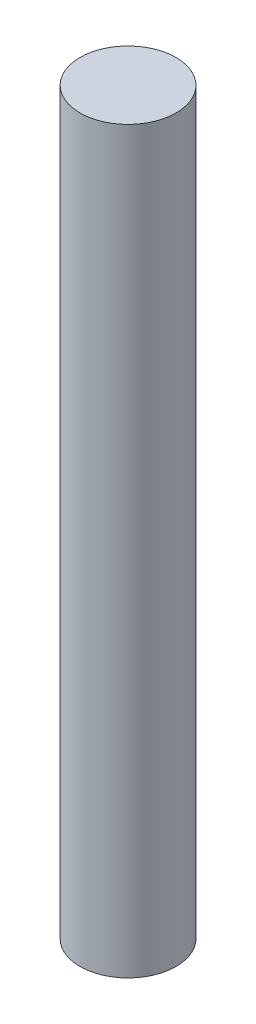
ISO-10303-21;
HEADER;
FILE_DESCRIPTION(('STEP AP214'),'2;1');
FILE_NAME('part.step','',(''),(''),'','','');
FILE_SCHEMA(('AUTOMOTIVE_DESIGN { 1 0 10303 214 1 1 1 1 }'));
ENDSEC;
DATA;
#1=APPLICATION_CONTEXT('core data for automotive mechanical design processes');
#2=APPLICATION_PROTOCOL_DEFINITION('international standard','automotive_design',2000,#1);
#3=PRODUCT_CONTEXT('',#1,'mechanical');
#4=PRODUCT('Part','Part','',(#3));
#5=PRODUCT_RELATED_PRODUCT_CATEGORY('part','',(#4));
#6=PRODUCT_DEFINITION_FORMATION('','',#4);
#7=PRODUCT_DEFINITION_CONTEXT('part definition',#1,'design');
#8=PRODUCT_DEFINITION('design','',#6,#7);
#9=PRODUCT_DEFINITION_SHAPE('','',#8);
#10=(LENGTH_UNIT() NAMED_UNIT(*) SI_UNIT(.MILLI.,.METRE.));
#11=(NAMED_UNIT(*) PLANE_ANGLE_UNIT() SI_UNIT($,.RADIAN.));
#12=(NAMED_UNIT(*) SI_UNIT($,.STERADIAN.) SOLID_ANGLE_UNIT());
#13=UNCERTAINTY_MEASURE_WITH_UNIT(LENGTH_MEASURE(1.E-05),#10,'distance_accuracy_value','');
#14=(GEOMETRIC_REPRESENTATION_CONTEXT(3) GLOBAL_UNCERTAINTY_ASSIGNED_CONTEXT((#13)) GLOBAL_UNIT_ASSIGNED_CONTEXT((#10,
#11,#12)) REPRESENTATION_CONTEXT('',''));
#15=CARTESIAN_POINT('',(0.,0.,0.));
#16=DIRECTION('',(0.,0.,1.));
#17=DIRECTION('',(1.,0.,0.));
#18=AXIS2_PLACEMENT_3D('',#15,#16,#17);
#19=CARTESIAN_POINT('',(0.,38.1,0.));
#20=DIRECTION('',(0.,-1.,0.));
#21=DIRECTION('',(0.,0.,-1.));
#22=AXIS2_PLACEMENT_3D('',#19,#20,#21);
#23=CYLINDRICAL_SURFACE('',#22,2.4765);
#24=CARTESIAN_POINT('',(0.,38.1,0.));
#25=DIRECTION('',(0.,1.,0.));
#26=DIRECTION('',(0.,0.,1.));
#27=AXIS2_PLACEMENT_3D('',#24,#25,#26);
#28=CIRCLE('',#27,2.4765);
#29=CARTESIAN_POINT('',(0.,38.1,-2.4765));
#30=VERTEX_POINT('',#29);
#31=EDGE_CURVE('E10',#30,#30,#28,.T.);
#32=CARTESIAN_POINT('',(0.,0.,0.));
#33=DIRECTION('',(0.,1.,0.));
#34=DIRECTION('',(0.,0.,1.));
#35=AXIS2_PLACEMENT_3D('',#32,#33,#34);
#36=CIRCLE('',#35,2.4765);
#37=CARTESIAN_POINT('',(0.,0.,-2.4765));
#38=VERTEX_POINT('',#37);
#39=EDGE_CURVE('E46',#38,#38,#36,.T.);
#40=CARTESIAN_POINT('',(0.,38.1,-2.4765));
#41=CARTESIAN_POINT('',(0.,37.703125,-2.4765));
#42=CARTESIAN_POINT('',(0.,37.30625,-2.4765));
#43=CARTESIAN_POINT('',(0.,36.5125,-2.4765));
#44=CARTESIAN_POINT('',(0.,36.115625,-2.4765));
#45=CARTESIAN_POINT('',(0.,35.321875,-2.4765));
#46=CARTESIAN_POINT('',(0.,34.925,-2.4765));
#47=CARTESIAN_POINT('',(0.,34.13125,-2.4765));
#48=CARTESIAN_POINT('',(0.,33.734375,-2.4765));
#49=CARTESIAN_POINT('',(0.,32.940625,-2.4765));
#50=CARTESIAN_POINT('',(0.,32.54375,-2.4765));
#51=CARTESIAN_POINT('',(0.,31.75,-2.4765));
#52=CARTESIAN_POINT('',(0.,31.353125,-2.4765));
#53=CARTESIAN_POINT('',(0.,30.559375,-2.4765));
#54=CARTESIAN_POINT('',(0.,30.1625,-2.4765));
#55=CARTESIAN_POINT('',(0.,29.36875,-2.4765));
#56=CARTESIAN_POINT('',(0.,28.971875,-2.4765));
#57=CARTESIAN_POINT('',(0.,28.178125,-2.4765));
#58=CARTESIAN_POINT('',(0.,27.78125,-2.4765));
#59=CARTESIAN_POINT('',(0.,26.9875,-2.4765));
#60=CARTESIAN_POINT('',(0.,26.590625,-2.4765));
#61=CARTESIAN_POINT('',(0.,25.796875,-2.4765));
#62=CARTESIAN_POINT('',(0.,25.4,-2.4765));
#63=CARTESIAN_POINT('',(0.,24.60625,-2.4765));
#64=CARTESIAN_POINT('',(0.,24.209375,-2.4765));
#65=CARTESIAN_POINT('',(0.,23.415625,-2.4765));
#66=CARTESIAN_POINT('',(0.,23.01875,-2.4765));
#67=CARTESIAN_POINT('',(0.,22.225,-2.4765));
#68=CARTESIAN_POINT('',(0.,21.828125,-2.4765));
#69=CARTESIAN_POINT('',(0.,21.034375,-2.4765));
#70=CARTESIAN_POINT('',(0.,20.6375,-2.4765));
#71=CARTESIAN_POINT('',(0.,19.84375,-2.4765));
#72=CARTESIAN_POINT('',(0.,19.446875,-2.4765));
#73=CARTESIAN_POINT('',(0.,18.653125,-2.4765));
#74=CARTESIAN_POINT('',(0.,18.25625,-2.4765));
#75=CARTESIAN_POINT('',(0.,17.4625,-2.4765));
#76=CARTESIAN_POINT('',(0.,17.065625,-2.4765));
#77=CARTESIAN_POINT('',(0.,16.271875,-2.4765));
#78=CARTESIAN_POINT('',(0.,15.875,-2.4765));
#79=CARTESIAN_POINT('',(0.,15.08125,-2.4765));
#80=CARTESIAN_POINT('',(0.,14.684375,-2.4765));
#81=CARTESIAN_POINT('',(0.,13.890625,-2.4765));
#82=CARTESIAN_POINT('',(0.,13.49375,-2.4765));
#83=CARTESIAN_POINT('',(0.,12.7,-2.4765));
#84=CARTESIAN_POINT('',(0.,12.303125,-2.4765));
#85=CARTESIAN_POINT('',(0.,11.509375,-2.4765));
#86=CARTESIAN_POINT('',(0.,11.1125,-2.4765));
#87=CARTESIAN_POINT('',(0.,10.31875,-2.4765));
#88=CARTESIAN_POINT('',(0.,9.921875,-2.4765));
#89=CARTESIAN_POINT('',(0.,9.128125,-2.4765));
#90=CARTESIAN_POINT('',(0.,8.73125,-2.4765));
#91=CARTESIAN_POINT('',(0.,7.9375,-2.4765));
#92=CARTESIAN_POINT('',(0.,7.540625,-2.4765));
#93=CARTESIAN_POINT('',(0.,6.746875,-2.4765));
#94=CARTESIAN_POINT('',(0.,6.35,-2.4765));
#95=CARTESIAN_POINT('',(0.,5.55625,-2.4765));
#96=CARTESIAN_POINT('',(0.,5.159375,-2.4765));
#97=CARTESIAN_POINT('',(0.,4.365625,-2.4765));
#98=CARTESIAN_POINT('',(0.,3.96875,-2.4765));
#99=CARTESIAN_POINT('',(0.,3.175,-2.4765));
#100=CARTESIAN_POINT('',(0.,2.778125,-2.4765));
#101=CARTESIAN_POINT('',(0.,1.984375,-2.4765));
#102=CARTESIAN_POINT('',(0.,1.5875,-2.4765));
#103=CARTESIAN_POINT('',(0.,0.79375,-2.4765));
#104=CARTESIAN_POINT('',(0.,0.396875,-2.4765));
#105=CARTESIAN_POINT('',(0.,0.,-2.4765));
#106=B_SPLINE_CURVE_WITH_KNOTS('',3,(#40,#41,#42,#43,#44,#45,#46,#47,#48,#49,#50,#51,#52,#53,
#54,#55,#56,#57,#58,#59,#60,#61,#62,#63,#64,#65,#66,#67,#68,#69,#70,#71,#72,#73,#74,#75,#76,#77,
#78,#79,#80,#81,#82,#83,#84,#85,#86,#87,#88,#89,#90,#91,#92,#93,#94,#95,#96,#97,#98,#99,#100,
#101,#102,#103,#104,#105),.UNSPECIFIED.,.F.,.F.,(4,2,2,2,2,2,2,2,2,2,2,2,2,2,2,2,2,2,2,2,2,2,2,
2,2,2,2,2,2,2,2,2,4),(0.,1.19062499999999,2.38124999999999,3.571875,4.7625,5.953125,7.14375,
8.33437499999999,9.525,10.715625,11.90625,13.096875,14.2875,15.478125,16.66875,17.859375,19.05,
20.240625,21.43125,22.621875,23.8125,25.003125,26.19375,27.384375,28.575,29.765625,30.95625,
32.146875,33.3375,34.528125,35.71875,36.909375,38.1),.UNSPECIFIED.);
#107=EDGE_CURVE('BSEAM43',#30,#38,#106,.T.);
#108=ORIENTED_EDGE('',*,*,#31,.F.);
#109=ORIENTED_EDGE('',*,*,#39,.T.);
#110=ORIENTED_EDGE('',*,*,#107,.T.);
#111=ORIENTED_EDGE('',*,*,#107,.F.);
#112=EDGE_LOOP('',(#108,#110,#109,#111));
#113=FACE_BOUND('',#112,.T.);
#114=ADVANCED_FACE('F43',(#113),#23,.T.);
#115=CARTESIAN_POINT('',(0.,38.1,0.));
#116=DIRECTION('',(0.,1.,0.));
#117=DIRECTION('',(0.,0.,1.));
#118=AXIS2_PLACEMENT_3D('',#115,#116,#117);
#119=PLANE('',#118);
#120=ORIENTED_EDGE('',*,*,#31,.T.);
#121=EDGE_LOOP('',(#120));
#122=FACE_BOUND('',#121,.T.);
#123=ADVANCED_FACE('F60',(#122),#119,.T.);
#124=CARTESIAN_POINT('',(0.,0.,0.));
#125=DIRECTION('',(0.,1.,0.));
#126=DIRECTION('',(0.,0.,1.));
#127=AXIS2_PLACEMENT_3D('',#124,#125,#126);
#128=PLANE('',#127);
#129=ORIENTED_EDGE('',*,*,#39,.F.);
#130=EDGE_LOOP('',(#129));
#131=FACE_BOUND('',#130,.T.);
#132=ADVANCED_FACE('F58',(#131),#128,.F.);
#133=CLOSED_SHELL('',(#114,#123,#132));
#134=MANIFOLD_SOLID_BREP('B2',#133);
#135=ADVANCED_BREP_SHAPE_REPRESENTATION('',(#18,#134),#14);
#136=SHAPE_DEFINITION_REPRESENTATION(#9,#135);
ENDSEC;
END-ISO-10303-21;
